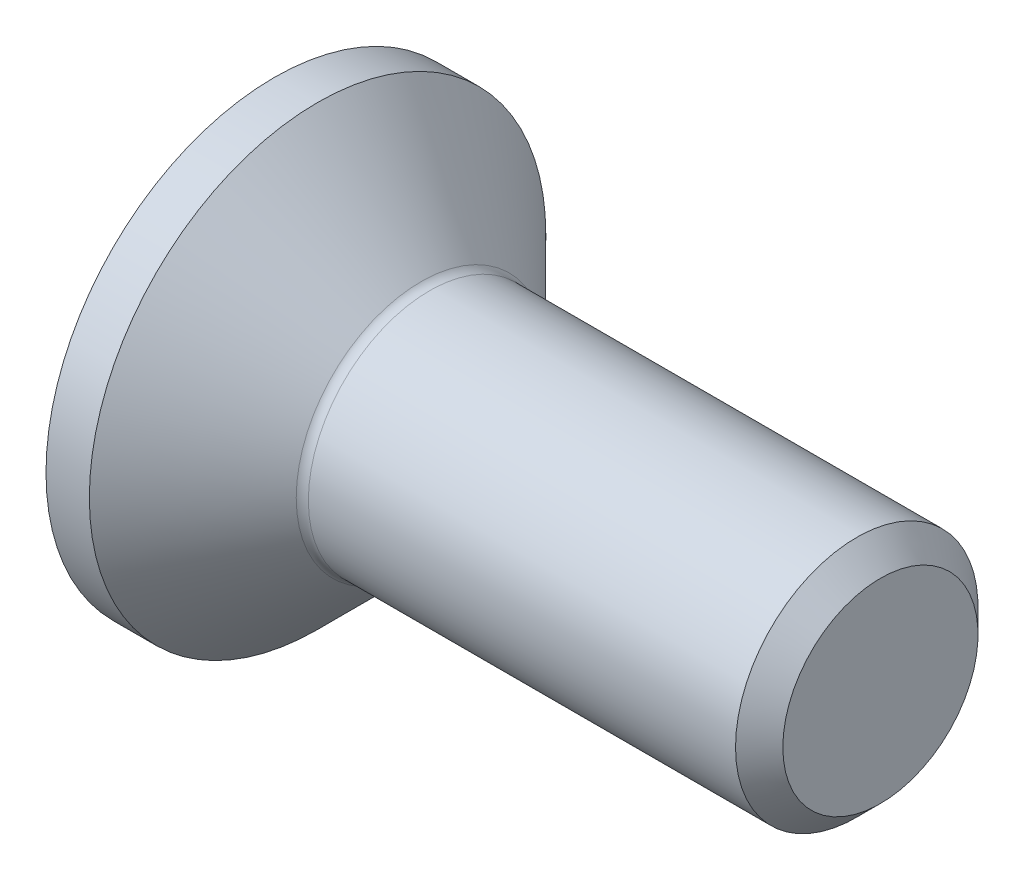
ISO-10303-21;
HEADER;
FILE_DESCRIPTION(('STEP AP214'),'2;1');
FILE_NAME('part.step','',(''),(''),'','','');
FILE_SCHEMA(('AUTOMOTIVE_DESIGN { 1 0 10303 214 1 1 1 1 }'));
ENDSEC;
DATA;
#1=APPLICATION_CONTEXT('core data for automotive mechanical design processes');
#2=APPLICATION_PROTOCOL_DEFINITION('international standard','automotive_design',2000,#1);
#3=PRODUCT_CONTEXT('',#1,'mechanical');
#4=PRODUCT('Part','Part','',(#3));
#5=PRODUCT_RELATED_PRODUCT_CATEGORY('part','',(#4));
#6=PRODUCT_DEFINITION_FORMATION('','',#4);
#7=PRODUCT_DEFINITION_CONTEXT('part definition',#1,'design');
#8=PRODUCT_DEFINITION('design','',#6,#7);
#9=PRODUCT_DEFINITION_SHAPE('','',#8);
#10=(LENGTH_UNIT() NAMED_UNIT(*) SI_UNIT(.MILLI.,.METRE.));
#11=(NAMED_UNIT(*) PLANE_ANGLE_UNIT() SI_UNIT($,.RADIAN.));
#12=(NAMED_UNIT(*) SI_UNIT($,.STERADIAN.) SOLID_ANGLE_UNIT());
#13=UNCERTAINTY_MEASURE_WITH_UNIT(LENGTH_MEASURE(1.E-05),#10,'distance_accuracy_value','');
#14=(GEOMETRIC_REPRESENTATION_CONTEXT(3) GLOBAL_UNCERTAINTY_ASSIGNED_CONTEXT((#13)) GLOBAL_UNIT_ASSIGNED_CONTEXT((#10,
#11,#12)) REPRESENTATION_CONTEXT('',''));
#15=CARTESIAN_POINT('',(0.,0.,0.));
#16=DIRECTION('',(0.,0.,1.));
#17=DIRECTION('',(1.,0.,0.));
#18=AXIS2_PLACEMENT_3D('',#15,#16,#17);
#19=CARTESIAN_POINT('',(0.,0.,0.));
#20=DIRECTION('',(-1.,0.,0.));
#21=DIRECTION('',(0.,0.,1.));
#22=AXIS2_PLACEMENT_3D('',#19,#20,#21);
#23=PLANE('',#22);
#24=CARTESIAN_POINT('',(0.,0.,0.));
#25=DIRECTION('',(-1.,0.,0.));
#26=DIRECTION('',(0.,0.,1.));
#27=AXIS2_PLACEMENT_3D('',#24,#25,#26);
#28=CIRCLE('',#27,3.765);
#29=CARTESIAN_POINT('',(0.,0.,3.765));
#30=VERTEX_POINT('',#29);
#31=EDGE_CURVE('E150',#30,#30,#28,.T.);
#32=ORIENTED_EDGE('',*,*,#31,.T.);
#33=EDGE_LOOP('',(#32));
#34=FACE_BOUND('',#33,.T.);
#35=DIRECTION('',(0.,-0.500000000000001,-0.866025403784438));
#36=VECTOR('',#35,1.);
#37=CARTESIAN_POINT('',(0.,-0.721687836487031,1.25));
#38=LINE('',#37,#36);
#39=CARTESIAN_POINT('',(0.,-0.721687836487031,1.25));
#40=VERTEX_POINT('',#39);
#41=CARTESIAN_POINT('',(0.,-1.44337567297407,0.));
#42=VERTEX_POINT('',#41);
#43=EDGE_CURVE('E122',#40,#42,#38,.T.);
#44=ORIENTED_EDGE('',*,*,#43,.T.);
#45=DIRECTION('',(0.,0.5,-0.866025403784438));
#46=VECTOR('',#45,1.);
#47=CARTESIAN_POINT('',(0.,-1.44337567297407,0.));
#48=LINE('',#47,#46);
#49=CARTESIAN_POINT('',(0.,-0.721687836487032,-1.25));
#50=VERTEX_POINT('',#49);
#51=EDGE_CURVE('E52',#42,#50,#48,.T.);
#52=ORIENTED_EDGE('',*,*,#51,.T.);
#53=DIRECTION('',(0.,1.,0.));
#54=VECTOR('',#53,1.);
#55=CARTESIAN_POINT('',(0.,-0.721687836487032,-1.25));
#56=LINE('',#55,#54);
#57=CARTESIAN_POINT('',(0.,0.721687836487033,-1.25));
#58=VERTEX_POINT('',#57);
#59=EDGE_CURVE('E137',#50,#58,#56,.T.);
#60=ORIENTED_EDGE('',*,*,#59,.T.);
#61=DIRECTION('',(0.,0.500000000000001,0.866025403784438));
#62=VECTOR('',#61,1.);
#63=CARTESIAN_POINT('',(0.,0.721687836487033,-1.25));
#64=LINE('',#63,#62);
#65=CARTESIAN_POINT('',(0.,1.44337567297407,0.));
#66=VERTEX_POINT('',#65);
#67=EDGE_CURVE('E395',#58,#66,#64,.T.);
#68=ORIENTED_EDGE('',*,*,#67,.T.);
#69=DIRECTION('',(0.,-0.5,0.866025403784439));
#70=VECTOR('',#69,1.);
#71=CARTESIAN_POINT('',(0.,1.44337567297407,0.));
#72=LINE('',#71,#70);
#73=CARTESIAN_POINT('',(0.,0.721687836487033,1.25));
#74=VERTEX_POINT('',#73);
#75=EDGE_CURVE('E398',#66,#74,#72,.T.);
#76=ORIENTED_EDGE('',*,*,#75,.T.);
#77=DIRECTION('',(0.,-1.,0.));
#78=VECTOR('',#77,1.);
#79=CARTESIAN_POINT('',(0.,0.721687836487033,1.25));
#80=LINE('',#79,#78);
#81=EDGE_CURVE('E401',#74,#40,#80,.T.);
#82=ORIENTED_EDGE('',*,*,#81,.T.);
#83=EDGE_LOOP('',(#44,#52,#60,#68,#76,#82));
#84=FACE_BOUND('',#83,.T.);
#85=ADVANCED_FACE('F37',(#34,#84),#23,.T.);
#86=CARTESIAN_POINT('',(9.99999999999999,1.61,0.));
#87=DIRECTION('',(1.,0.,0.));
#88=DIRECTION('',(0.,0.,-1.));
#89=AXIS2_PLACEMENT_3D('',#86,#87,#88);
#90=PLANE('',#89);
#91=CARTESIAN_POINT('',(9.99999999999999,0.,0.));
#92=DIRECTION('',(-1.,0.,0.));
#93=DIRECTION('',(0.,0.,1.));
#94=AXIS2_PLACEMENT_3D('',#91,#92,#93);
#95=CIRCLE('',#94,1.61);
#96=CARTESIAN_POINT('',(9.99999999999999,0.,1.61));
#97=VERTEX_POINT('',#96);
#98=EDGE_CURVE('E160',#97,#97,#95,.T.);
#99=ORIENTED_EDGE('',*,*,#98,.F.);
#100=EDGE_LOOP('',(#99));
#101=FACE_BOUND('',#100,.T.);
#102=ADVANCED_FACE('F180',(#101),#90,.T.);
#103=CARTESIAN_POINT('',(9.99999999999999,0.,0.));
#104=DIRECTION('',(-1.,0.,0.));
#105=DIRECTION('',(0.,0.,1.));
#106=AXIS2_PLACEMENT_3D('',#103,#104,#105);
#107=CONICAL_SURFACE('',#106,1.61,0.785398163397446);
#108=CARTESIAN_POINT('',(9.60999999999999,0.,0.));
#109=DIRECTION('',(-1.,0.,0.));
#110=DIRECTION('',(0.,0.,1.));
#111=AXIS2_PLACEMENT_3D('',#108,#109,#110);
#112=CIRCLE('',#111,2.);
#113=CARTESIAN_POINT('',(9.60999999999999,0.,2.));
#114=VERTEX_POINT('',#113);
#115=EDGE_CURVE('E157',#114,#114,#112,.T.);
#116=ORIENTED_EDGE('',*,*,#115,.F.);
#117=EDGE_LOOP('',(#116));
#118=FACE_BOUND('',#117,.T.);
#119=ORIENTED_EDGE('',*,*,#98,.T.);
#120=EDGE_LOOP('',(#119));
#121=FACE_BOUND('',#120,.T.);
#122=ADVANCED_FACE('F186',(#118,#121),#107,.T.);
#123=CARTESIAN_POINT('',(0.,0.,0.));
#124=DIRECTION('',(-1.,0.,0.));
#125=DIRECTION('',(0.,0.,1.));
#126=AXIS2_PLACEMENT_3D('',#123,#124,#125);
#127=CYLINDRICAL_SURFACE('',#126,2.);
#128=CARTESIAN_POINT('',(2.56284271247462,0.,0.));
#129=DIRECTION('',(-1.,0.,0.));
#130=DIRECTION('',(0.,0.,1.));
#131=AXIS2_PLACEMENT_3D('',#128,#129,#130);
#132=CIRCLE('',#131,2.);
#133=CARTESIAN_POINT('',(2.56284271247462,0.,2.));
#134=VERTEX_POINT('',#133);
#135=EDGE_CURVE('E11',#134,#134,#132,.F.);
#136=ORIENTED_EDGE('',*,*,#135,.T.);
#137=EDGE_LOOP('',(#136));
#138=FACE_BOUND('',#137,.T.);
#139=ORIENTED_EDGE('',*,*,#115,.T.);
#140=EDGE_LOOP('',(#139));
#141=FACE_BOUND('',#140,.T.);
#142=ADVANCED_FACE('F194',(#138,#141),#127,.T.);
#143=CARTESIAN_POINT('',(0.71500000000001,0.,0.));
#144=DIRECTION('',(-1.,0.,0.));
#145=DIRECTION('',(0.,0.,1.));
#146=AXIS2_PLACEMENT_3D('',#143,#144,#145);
#147=CONICAL_SURFACE('',#146,3.765,0.785398163397451);
#148=CARTESIAN_POINT('',(2.42142135623731,0.,0.));
#149=DIRECTION('',(-1.,0.,0.));
#150=DIRECTION('',(0.,0.,1.));
#151=AXIS2_PLACEMENT_3D('',#148,#149,#150);
#152=CIRCLE('',#151,2.05857864376269);
#153=CARTESIAN_POINT('',(2.42142135623731,0.,2.05857864376269));
#154=VERTEX_POINT('',#153);
#155=EDGE_CURVE('E45',#154,#154,#152,.T.);
#156=ORIENTED_EDGE('',*,*,#155,.T.);
#157=EDGE_LOOP('',(#156));
#158=FACE_BOUND('',#157,.T.);
#159=CARTESIAN_POINT('',(0.71500000000001,0.,0.));
#160=DIRECTION('',(-1.,0.,0.));
#161=DIRECTION('',(0.,0.,1.));
#162=AXIS2_PLACEMENT_3D('',#159,#160,#161);
#163=CIRCLE('',#162,3.765);
#164=CARTESIAN_POINT('',(0.71500000000001,0.,3.765));
#165=VERTEX_POINT('',#164);
#166=EDGE_CURVE('E154',#165,#165,#163,.T.);
#167=ORIENTED_EDGE('',*,*,#166,.F.);
#168=EDGE_LOOP('',(#167));
#169=FACE_BOUND('',#168,.T.);
#170=ADVANCED_FACE('F165',(#158,#169),#147,.T.);
#171=CARTESIAN_POINT('',(0.,0.,0.));
#172=DIRECTION('',(-1.,0.,0.));
#173=DIRECTION('',(0.,0.,1.));
#174=AXIS2_PLACEMENT_3D('',#171,#172,#173);
#175=CYLINDRICAL_SURFACE('',#174,3.765);
#176=ORIENTED_EDGE('',*,*,#166,.T.);
#177=EDGE_LOOP('',(#176));
#178=FACE_BOUND('',#177,.T.);
#179=ORIENTED_EDGE('',*,*,#31,.F.);
#180=EDGE_LOOP('',(#179));
#181=FACE_BOUND('',#180,.T.);
#182=ADVANCED_FACE('F169',(#178,#181),#175,.T.);
#183=CARTESIAN_POINT('',(2.56284271247462,0.,0.));
#184=DIRECTION('',(-1.,0.,0.));
#185=DIRECTION('',(0.,0.,1.));
#186=AXIS2_PLACEMENT_3D('',#183,#184,#185);
#187=TOROIDAL_SURFACE('',#186,2.2,0.2);
#188=ORIENTED_EDGE('',*,*,#135,.F.);
#189=EDGE_LOOP('',(#188));
#190=FACE_BOUND('',#189,.T.);
#191=ORIENTED_EDGE('',*,*,#155,.F.);
#192=EDGE_LOOP('',(#191));
#193=FACE_BOUND('',#192,.T.);
#194=ADVANCED_FACE('F39',(#190,#193),#187,.F.);
#195=CARTESIAN_POINT('',(1.5,-1.44337567297407,0.));
#196=DIRECTION('',(0.,0.866025403784438,0.500000000000001));
#197=DIRECTION('',(0.,-0.500000000000001,0.866025403784438));
#198=AXIS2_PLACEMENT_3D('',#195,#196,#197);
#199=PLANE('',#198);
#200=ORIENTED_EDGE('',*,*,#51,.F.);
#201=DIRECTION('',(-1.,0.,0.));
#202=VECTOR('',#201,1.);
#203=CARTESIAN_POINT('',(1.5,-1.44337567297407,0.));
#204=LINE('',#203,#202);
#205=CARTESIAN_POINT('',(1.5,-1.44337567297407,0.));
#206=VERTEX_POINT('',#205);
#207=EDGE_CURVE('E392',#206,#42,#204,.T.);
#208=ORIENTED_EDGE('',*,*,#207,.F.);
#209=DIRECTION('',(0.,0.5,-0.866025403784438));
#210=VECTOR('',#209,1.);
#211=CARTESIAN_POINT('',(1.5,-1.44337567297407,0.));
#212=LINE('',#211,#210);
#213=CARTESIAN_POINT('',(1.5,-1.08253175473055,-0.625000000000001));
#214=VERTEX_POINT('',#213);
#215=EDGE_CURVE('E119',#206,#214,#212,.T.);
#216=ORIENTED_EDGE('',*,*,#215,.T.);
#217=CARTESIAN_POINT('',(1.5,-0.721687836487032,-1.25));
#218=VERTEX_POINT('',#217);
#219=EDGE_CURVE('E113',#214,#218,#212,.T.);
#220=ORIENTED_EDGE('',*,*,#219,.T.);
#221=DIRECTION('',(-1.,0.,0.));
#222=VECTOR('',#221,1.);
#223=CARTESIAN_POINT('',(1.5,-0.721687836487032,-1.25));
#224=LINE('',#223,#222);
#225=EDGE_CURVE('E117',#218,#50,#224,.T.);
#226=ORIENTED_EDGE('',*,*,#225,.T.);
#227=EDGE_LOOP('',(#200,#208,#216,#220,#226));
#228=FACE_BOUND('',#227,.T.);
#229=ADVANCED_FACE('F115',(#228),#199,.T.);
#230=CARTESIAN_POINT('',(1.5,-0.721687836487032,-1.25));
#231=DIRECTION('',(0.,0.,1.));
#232=DIRECTION('',(0.,-1.,0.));
#233=AXIS2_PLACEMENT_3D('',#230,#231,#232);
#234=PLANE('',#233);
#235=ORIENTED_EDGE('',*,*,#59,.F.);
#236=ORIENTED_EDGE('',*,*,#225,.F.);
#237=DIRECTION('',(0.,1.,0.));
#238=VECTOR('',#237,1.);
#239=CARTESIAN_POINT('',(1.5,-0.721687836487032,-1.25));
#240=LINE('',#239,#238);
#241=CARTESIAN_POINT('',(1.5,0.,-1.25));
#242=VERTEX_POINT('',#241);
#243=EDGE_CURVE('E125',#218,#242,#240,.T.);
#244=ORIENTED_EDGE('',*,*,#243,.T.);
#245=CARTESIAN_POINT('',(1.5,0.721687836487033,-1.25));
#246=VERTEX_POINT('',#245);
#247=EDGE_CURVE('E132',#242,#246,#240,.T.);
#248=ORIENTED_EDGE('',*,*,#247,.T.);
#249=DIRECTION('',(-1.,0.,0.));
#250=VECTOR('',#249,1.);
#251=CARTESIAN_POINT('',(1.5,0.721687836487033,-1.25));
#252=LINE('',#251,#250);
#253=EDGE_CURVE('E139',#246,#58,#252,.T.);
#254=ORIENTED_EDGE('',*,*,#253,.T.);
#255=EDGE_LOOP('',(#235,#236,#244,#248,#254));
#256=FACE_BOUND('',#255,.T.);
#257=ADVANCED_FACE('F134',(#256),#234,.T.);
#258=CARTESIAN_POINT('',(1.5,0.721687836487033,-1.25));
#259=DIRECTION('',(0.,-0.866025403784438,0.5));
#260=DIRECTION('',(0.,-0.500000000000001,-0.866025403784438));
#261=AXIS2_PLACEMENT_3D('',#258,#259,#260);
#262=PLANE('',#261);
#263=ORIENTED_EDGE('',*,*,#67,.F.);
#264=ORIENTED_EDGE('',*,*,#253,.F.);
#265=DIRECTION('',(0.,0.500000000000001,0.866025403784438));
#266=VECTOR('',#265,1.);
#267=CARTESIAN_POINT('',(1.5,0.721687836487033,-1.25));
#268=LINE('',#267,#266);
#269=CARTESIAN_POINT('',(1.5,1.08253175473055,-0.625000000000001));
#270=VERTEX_POINT('',#269);
#271=EDGE_CURVE('E385',#246,#270,#268,.T.);
#272=ORIENTED_EDGE('',*,*,#271,.T.);
#273=CARTESIAN_POINT('',(1.5,1.44337567297407,0.));
#274=VERTEX_POINT('',#273);
#275=EDGE_CURVE('E131',#270,#274,#268,.T.);
#276=ORIENTED_EDGE('',*,*,#275,.T.);
#277=DIRECTION('',(-1.,0.,0.));
#278=VECTOR('',#277,1.);
#279=CARTESIAN_POINT('',(1.5,1.44337567297407,0.));
#280=LINE('',#279,#278);
#281=EDGE_CURVE('E145',#274,#66,#280,.T.);
#282=ORIENTED_EDGE('',*,*,#281,.T.);
#283=EDGE_LOOP('',(#263,#264,#272,#276,#282));
#284=FACE_BOUND('',#283,.T.);
#285=ADVANCED_FACE('F266',(#284),#262,.T.);
#286=CARTESIAN_POINT('',(1.5,1.44337567297407,0.));
#287=DIRECTION('',(0.,-0.866025403784439,-0.5));
#288=DIRECTION('',(0.,0.5,-0.866025403784439));
#289=AXIS2_PLACEMENT_3D('',#286,#287,#288);
#290=PLANE('',#289);
#291=ORIENTED_EDGE('',*,*,#75,.F.);
#292=ORIENTED_EDGE('',*,*,#281,.F.);
#293=DIRECTION('',(0.,-0.5,0.866025403784439));
#294=VECTOR('',#293,1.);
#295=CARTESIAN_POINT('',(1.5,1.44337567297407,0.));
#296=LINE('',#295,#294);
#297=CARTESIAN_POINT('',(1.5,1.08253175473055,0.625));
#298=VERTEX_POINT('',#297);
#299=EDGE_CURVE('E60',#274,#298,#296,.T.);
#300=ORIENTED_EDGE('',*,*,#299,.T.);
#301=CARTESIAN_POINT('',(1.5,0.721687836487033,1.25));
#302=VERTEX_POINT('',#301);
#303=EDGE_CURVE('E364',#298,#302,#296,.T.);
#304=ORIENTED_EDGE('',*,*,#303,.T.);
#305=DIRECTION('',(-1.,0.,0.));
#306=VECTOR('',#305,1.);
#307=CARTESIAN_POINT('',(1.5,0.721687836487033,1.25));
#308=LINE('',#307,#306);
#309=EDGE_CURVE('E378',#302,#74,#308,.T.);
#310=ORIENTED_EDGE('',*,*,#309,.T.);
#311=EDGE_LOOP('',(#291,#292,#300,#304,#310));
#312=FACE_BOUND('',#311,.T.);
#313=ADVANCED_FACE('F274',(#312),#290,.T.);
#314=CARTESIAN_POINT('',(1.5,0.721687836487033,1.25));
#315=DIRECTION('',(0.,0.,-1.));
#316=DIRECTION('',(0.,1.,0.));
#317=AXIS2_PLACEMENT_3D('',#314,#315,#316);
#318=PLANE('',#317);
#319=ORIENTED_EDGE('',*,*,#81,.F.);
#320=ORIENTED_EDGE('',*,*,#309,.F.);
#321=DIRECTION('',(0.,-1.,0.));
#322=VECTOR('',#321,1.);
#323=CARTESIAN_POINT('',(1.5,0.721687836487033,1.25));
#324=LINE('',#323,#322);
#325=CARTESIAN_POINT('',(1.5,0.,1.25));
#326=VERTEX_POINT('',#325);
#327=EDGE_CURVE('E363',#302,#326,#324,.T.);
#328=ORIENTED_EDGE('',*,*,#327,.T.);
#329=CARTESIAN_POINT('',(1.5,-0.721687836487031,1.25));
#330=VERTEX_POINT('',#329);
#331=EDGE_CURVE('E369',#326,#330,#324,.T.);
#332=ORIENTED_EDGE('',*,*,#331,.T.);
#333=DIRECTION('',(-1.,0.,0.));
#334=VECTOR('',#333,1.);
#335=CARTESIAN_POINT('',(1.5,-0.721687836487031,1.25));
#336=LINE('',#335,#334);
#337=EDGE_CURVE('E407',#330,#40,#336,.T.);
#338=ORIENTED_EDGE('',*,*,#337,.T.);
#339=EDGE_LOOP('',(#319,#320,#328,#332,#338));
#340=FACE_BOUND('',#339,.T.);
#341=ADVANCED_FACE('F283',(#340),#318,.T.);
#342=CARTESIAN_POINT('',(1.5,-0.721687836487031,1.25));
#343=DIRECTION('',(0.,0.866025403784438,-0.500000000000001));
#344=DIRECTION('',(0.,0.500000000000001,0.866025403784438));
#345=AXIS2_PLACEMENT_3D('',#342,#343,#344);
#346=PLANE('',#345);
#347=ORIENTED_EDGE('',*,*,#43,.F.);
#348=ORIENTED_EDGE('',*,*,#337,.F.);
#349=DIRECTION('',(0.,-0.500000000000001,-0.866025403784438));
#350=VECTOR('',#349,1.);
#351=CARTESIAN_POINT('',(1.5,-0.721687836487031,1.25));
#352=LINE('',#351,#350);
#353=CARTESIAN_POINT('',(1.5,-1.08253175473055,0.625000000000002));
#354=VERTEX_POINT('',#353);
#355=EDGE_CURVE('E372',#330,#354,#352,.T.);
#356=ORIENTED_EDGE('',*,*,#355,.T.);
#357=EDGE_CURVE('E379',#354,#206,#352,.T.);
#358=ORIENTED_EDGE('',*,*,#357,.T.);
#359=ORIENTED_EDGE('',*,*,#207,.T.);
#360=EDGE_LOOP('',(#347,#348,#356,#358,#359));
#361=FACE_BOUND('',#360,.T.);
#362=ADVANCED_FACE('F291',(#361),#346,.T.);
#363=CARTESIAN_POINT('',(1.5,-1.44337567297407,0.));
#364=DIRECTION('',(-1.,0.,0.));
#365=DIRECTION('',(0.,0.,1.));
#366=AXIS2_PLACEMENT_3D('',#363,#364,#365);
#367=PLANE('',#366);
#368=CARTESIAN_POINT('',(1.5,0.,0.));
#369=DIRECTION('',(-1.,0.,0.));
#370=DIRECTION('',(0.,0.,1.));
#371=AXIS2_PLACEMENT_3D('',#368,#369,#370);
#372=CIRCLE('',#371,1.25);
#373=EDGE_CURVE('E138',#354,#326,#372,.T.);
#374=ORIENTED_EDGE('',*,*,#373,.F.);
#375=ORIENTED_EDGE('',*,*,#355,.F.);
#376=ORIENTED_EDGE('',*,*,#331,.F.);
#377=EDGE_LOOP('',(#374,#375,#376));
#378=FACE_BOUND('',#377,.T.);
#379=ADVANCED_FACE('F300',(#378),#367,.T.);
#380=EDGE_CURVE('E142',#214,#354,#372,.T.);
#381=ORIENTED_EDGE('',*,*,#380,.F.);
#382=ORIENTED_EDGE('',*,*,#215,.F.);
#383=ORIENTED_EDGE('',*,*,#357,.F.);
#384=EDGE_LOOP('',(#381,#382,#383));
#385=FACE_BOUND('',#384,.T.);
#386=ADVANCED_FACE('F309',(#385),#367,.T.);
#387=EDGE_CURVE('E127',#242,#214,#372,.T.);
#388=ORIENTED_EDGE('',*,*,#387,.F.);
#389=ORIENTED_EDGE('',*,*,#243,.F.);
#390=ORIENTED_EDGE('',*,*,#219,.F.);
#391=EDGE_LOOP('',(#388,#389,#390));
#392=FACE_BOUND('',#391,.T.);
#393=ADVANCED_FACE('F126',(#392),#367,.T.);
#394=EDGE_CURVE('E381',#270,#242,#372,.T.);
#395=ORIENTED_EDGE('',*,*,#394,.F.);
#396=ORIENTED_EDGE('',*,*,#271,.F.);
#397=ORIENTED_EDGE('',*,*,#247,.F.);
#398=EDGE_LOOP('',(#395,#396,#397));
#399=FACE_BOUND('',#398,.T.);
#400=ADVANCED_FACE('F325',(#399),#367,.T.);
#401=EDGE_CURVE('E151',#298,#270,#372,.T.);
#402=ORIENTED_EDGE('',*,*,#401,.F.);
#403=ORIENTED_EDGE('',*,*,#299,.F.);
#404=ORIENTED_EDGE('',*,*,#275,.F.);
#405=EDGE_LOOP('',(#402,#403,#404));
#406=FACE_BOUND('',#405,.T.);
#407=ADVANCED_FACE('F332',(#406),#367,.T.);
#408=EDGE_CURVE('E144',#326,#298,#372,.T.);
#409=ORIENTED_EDGE('',*,*,#408,.F.);
#410=ORIENTED_EDGE('',*,*,#327,.F.);
#411=ORIENTED_EDGE('',*,*,#303,.F.);
#412=EDGE_LOOP('',(#409,#410,#411));
#413=FACE_BOUND('',#412,.T.);
#414=ADVANCED_FACE('F248',(#413),#367,.T.);
#415=CARTESIAN_POINT('',(1.5,0.,0.));
#416=DIRECTION('',(-1.,0.,0.));
#417=DIRECTION('',(0.,0.,1.));
#418=AXIS2_PLACEMENT_3D('',#415,#416,#417);
#419=CONICAL_SURFACE('',#418,1.25,1.04719755119659);
#420=CARTESIAN_POINT('',(2.22168783648704,0.,0.));
#421=VERTEX_POINT('',#420);
#422=VERTEX_LOOP('',#421);
#423=FACE_BOUND('',#422,.T.);
#424=ORIENTED_EDGE('',*,*,#408,.T.);
#425=ORIENTED_EDGE('',*,*,#401,.T.);
#426=ORIENTED_EDGE('',*,*,#394,.T.);
#427=ORIENTED_EDGE('',*,*,#387,.T.);
#428=ORIENTED_EDGE('',*,*,#380,.T.);
#429=ORIENTED_EDGE('',*,*,#373,.T.);
#430=EDGE_LOOP('',(#424,#425,#426,#427,#428,#429));
#431=FACE_BOUND('',#430,.T.);
#432=ADVANCED_FACE('F190',(#423,#431),#419,.F.);
#433=CLOSED_SHELL('',(#85,#102,#122,#142,#170,#182,#194,#229,#257,#285,#313,#341,#362,#379,#386,
#393,#400,#407,#414,#432));
#434=MANIFOLD_SOLID_BREP('B2',#433);
#435=ADVANCED_BREP_SHAPE_REPRESENTATION('',(#18,#434),#14);
#436=SHAPE_DEFINITION_REPRESENTATION(#9,#435);
ENDSEC;
END-ISO-10303-21;
